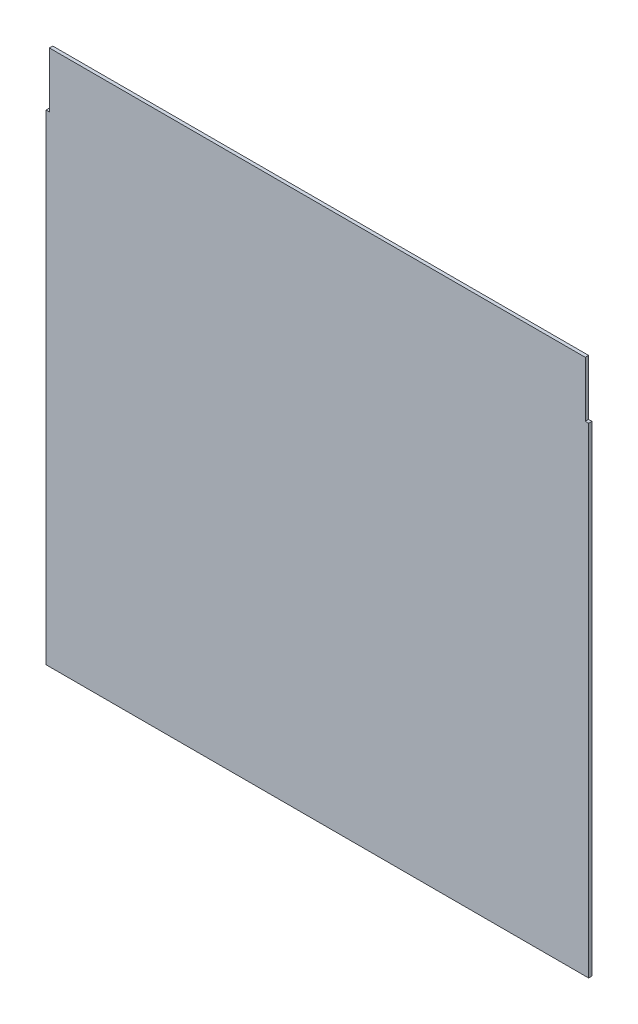
ISO-10303-21;
HEADER;
FILE_DESCRIPTION(('STEP AP214'),'2;1');
FILE_NAME('part.step','',(''),(''),'','','');
FILE_SCHEMA(('AUTOMOTIVE_DESIGN { 1 0 10303 214 1 1 1 1 }'));
ENDSEC;
DATA;
#1=APPLICATION_CONTEXT('core data for automotive mechanical design processes');
#2=APPLICATION_PROTOCOL_DEFINITION('international standard','automotive_design',2000,#1);
#3=PRODUCT_CONTEXT('',#1,'mechanical');
#4=PRODUCT('Part','Part','',(#3));
#5=PRODUCT_RELATED_PRODUCT_CATEGORY('part','',(#4));
#6=PRODUCT_DEFINITION_FORMATION('','',#4);
#7=PRODUCT_DEFINITION_CONTEXT('part definition',#1,'design');
#8=PRODUCT_DEFINITION('design','',#6,#7);
#9=PRODUCT_DEFINITION_SHAPE('','',#8);
#10=(LENGTH_UNIT() NAMED_UNIT(*) SI_UNIT(.MILLI.,.METRE.));
#11=(NAMED_UNIT(*) PLANE_ANGLE_UNIT() SI_UNIT($,.RADIAN.));
#12=(NAMED_UNIT(*) SI_UNIT($,.STERADIAN.) SOLID_ANGLE_UNIT());
#13=UNCERTAINTY_MEASURE_WITH_UNIT(LENGTH_MEASURE(1.E-05),#10,'distance_accuracy_value','');
#14=(GEOMETRIC_REPRESENTATION_CONTEXT(3) GLOBAL_UNCERTAINTY_ASSIGNED_CONTEXT((#13)) GLOBAL_UNIT_ASSIGNED_CONTEXT((#10,
#11,#12)) REPRESENTATION_CONTEXT('',''));
#15=CARTESIAN_POINT('',(0.,0.,0.));
#16=DIRECTION('',(0.,0.,1.));
#17=DIRECTION('',(1.,0.,0.));
#18=AXIS2_PLACEMENT_3D('',#15,#16,#17);
#19=CARTESIAN_POINT('',(254.,-254.,3.175));
#20=DIRECTION('',(-1.,0.,0.));
#21=DIRECTION('',(0.,0.,1.));
#22=AXIS2_PLACEMENT_3D('',#19,#20,#21);
#23=PLANE('',#22);
#24=DIRECTION('',(0.,0.,1.));
#25=VECTOR('',#24,1.);
#26=CARTESIAN_POINT('',(254.,201.45375,0.));
#27=LINE('',#26,#25);
#28=CARTESIAN_POINT('',(254.,201.45375,0.));
#29=VERTEX_POINT('',#28);
#30=CARTESIAN_POINT('',(254.,201.45375,3.175));
#31=VERTEX_POINT('',#30);
#32=EDGE_CURVE('E66',#29,#31,#27,.T.);
#33=ORIENTED_EDGE('',*,*,#32,.F.);
#34=DIRECTION('',(0.,1.,0.));
#35=VECTOR('',#34,1.);
#36=CARTESIAN_POINT('',(254.,-254.,0.));
#37=LINE('',#36,#35);
#38=CARTESIAN_POINT('',(254.,254.,0.));
#39=VERTEX_POINT('',#38);
#40=EDGE_CURVE('E163',#29,#39,#37,.T.);
#41=ORIENTED_EDGE('',*,*,#40,.T.);
#42=DIRECTION('',(0.,0.,-1.));
#43=VECTOR('',#42,1.);
#44=CARTESIAN_POINT('',(254.,254.,3.175));
#45=LINE('',#44,#43);
#46=CARTESIAN_POINT('',(254.,254.,3.175));
#47=VERTEX_POINT('',#46);
#48=EDGE_CURVE('E11',#47,#39,#45,.T.);
#49=ORIENTED_EDGE('',*,*,#48,.F.);
#50=DIRECTION('',(0.,1.,0.));
#51=VECTOR('',#50,1.);
#52=CARTESIAN_POINT('',(254.,-254.,3.175));
#53=LINE('',#52,#51);
#54=EDGE_CURVE('E169',#31,#47,#53,.T.);
#55=ORIENTED_EDGE('',*,*,#54,.F.);
#56=EDGE_LOOP('',(#33,#41,#49,#55));
#57=FACE_BOUND('',#56,.T.);
#58=ADVANCED_FACE('F43',(#57),#23,.F.);
#59=CARTESIAN_POINT('',(-254.,254.,3.175));
#60=DIRECTION('',(0.,-1.,0.));
#61=DIRECTION('',(0.,0.,-1.));
#62=AXIS2_PLACEMENT_3D('',#59,#60,#61);
#63=PLANE('',#62);
#64=DIRECTION('',(-1.,0.,0.));
#65=VECTOR('',#64,1.);
#66=CARTESIAN_POINT('',(-254.,254.,0.));
#67=LINE('',#66,#65);
#68=CARTESIAN_POINT('',(-254.,254.,0.));
#69=VERTEX_POINT('',#68);
#70=EDGE_CURVE('E180',#39,#69,#67,.T.);
#71=ORIENTED_EDGE('',*,*,#70,.T.);
#72=DIRECTION('',(0.,0.,-1.));
#73=VECTOR('',#72,1.);
#74=CARTESIAN_POINT('',(-254.,254.,3.175));
#75=LINE('',#74,#73);
#76=CARTESIAN_POINT('',(-254.,254.,3.175));
#77=VERTEX_POINT('',#76);
#78=EDGE_CURVE('E51',#77,#69,#75,.T.);
#79=ORIENTED_EDGE('',*,*,#78,.F.);
#80=DIRECTION('',(-1.,0.,0.));
#81=VECTOR('',#80,1.);
#82=CARTESIAN_POINT('',(-254.,254.,3.175));
#83=LINE('',#82,#81);
#84=EDGE_CURVE('E172',#47,#77,#83,.T.);
#85=ORIENTED_EDGE('',*,*,#84,.F.);
#86=ORIENTED_EDGE('',*,*,#48,.T.);
#87=EDGE_LOOP('',(#71,#79,#85,#86));
#88=FACE_BOUND('',#87,.T.);
#89=ADVANCED_FACE('F206',(#88),#63,.F.);
#90=CARTESIAN_POINT('',(-254.,-254.,3.175));
#91=DIRECTION('',(1.,0.,0.));
#92=DIRECTION('',(0.,0.,-1.));
#93=AXIS2_PLACEMENT_3D('',#90,#91,#92);
#94=PLANE('',#93);
#95=DIRECTION('',(0.,-1.,0.));
#96=VECTOR('',#95,1.);
#97=CARTESIAN_POINT('',(-254.,-254.,0.));
#98=LINE('',#97,#96);
#99=CARTESIAN_POINT('',(-254.,201.45375,0.));
#100=VERTEX_POINT('',#99);
#101=EDGE_CURVE('E183',#69,#100,#98,.T.);
#102=ORIENTED_EDGE('',*,*,#101,.T.);
#103=DIRECTION('',(0.,0.,1.));
#104=VECTOR('',#103,1.);
#105=CARTESIAN_POINT('',(-254.,201.45375,0.));
#106=LINE('',#105,#104);
#107=CARTESIAN_POINT('',(-254.,201.45375,3.175));
#108=VERTEX_POINT('',#107);
#109=EDGE_CURVE('E145',#100,#108,#106,.T.);
#110=ORIENTED_EDGE('',*,*,#109,.T.);
#111=DIRECTION('',(0.,-1.,0.));
#112=VECTOR('',#111,1.);
#113=CARTESIAN_POINT('',(-254.,-254.,3.175));
#114=LINE('',#113,#112);
#115=EDGE_CURVE('E120',#77,#108,#114,.T.);
#116=ORIENTED_EDGE('',*,*,#115,.F.);
#117=ORIENTED_EDGE('',*,*,#78,.T.);
#118=EDGE_LOOP('',(#102,#110,#116,#117));
#119=FACE_BOUND('',#118,.T.);
#120=ADVANCED_FACE('F194',(#119),#94,.F.);
#121=CARTESIAN_POINT('',(-254.,-254.,3.175));
#122=DIRECTION('',(0.,1.,0.));
#123=DIRECTION('',(0.,0.,1.));
#124=AXIS2_PLACEMENT_3D('',#121,#122,#123);
#125=PLANE('',#124);
#126=DIRECTION('',(1.,0.,0.));
#127=VECTOR('',#126,1.);
#128=CARTESIAN_POINT('',(-254.,-254.,0.));
#129=LINE('',#128,#127);
#130=CARTESIAN_POINT('',(-257.175,-254.,0.));
#131=VERTEX_POINT('',#130);
#132=CARTESIAN_POINT('',(257.175,-254.,0.));
#133=VERTEX_POINT('',#132);
#134=EDGE_CURVE('E173',#131,#133,#129,.T.);
#135=ORIENTED_EDGE('',*,*,#134,.T.);
#136=DIRECTION('',(0.,0.,1.));
#137=VECTOR('',#136,1.);
#138=CARTESIAN_POINT('',(257.175,-254.,0.));
#139=LINE('',#138,#137);
#140=CARTESIAN_POINT('',(257.175,-254.,3.175));
#141=VERTEX_POINT('',#140);
#142=EDGE_CURVE('E114',#133,#141,#139,.T.);
#143=ORIENTED_EDGE('',*,*,#142,.T.);
#144=DIRECTION('',(1.,0.,0.));
#145=VECTOR('',#144,1.);
#146=CARTESIAN_POINT('',(-254.,-254.,3.175));
#147=LINE('',#146,#145);
#148=CARTESIAN_POINT('',(-257.175,-254.,3.175));
#149=VERTEX_POINT('',#148);
#150=EDGE_CURVE('E108',#149,#141,#147,.T.);
#151=ORIENTED_EDGE('',*,*,#150,.F.);
#152=DIRECTION('',(0.,0.,1.));
#153=VECTOR('',#152,1.);
#154=CARTESIAN_POINT('',(-257.175,-254.,0.));
#155=LINE('',#154,#153);
#156=EDGE_CURVE('E111',#131,#149,#155,.T.);
#157=ORIENTED_EDGE('',*,*,#156,.F.);
#158=EDGE_LOOP('',(#135,#143,#151,#157));
#159=FACE_BOUND('',#158,.T.);
#160=ADVANCED_FACE('F110',(#159),#125,.F.);
#161=CARTESIAN_POINT('',(0.,0.,3.175));
#162=DIRECTION('',(0.,0.,-1.));
#163=DIRECTION('',(-1.,0.,0.));
#164=AXIS2_PLACEMENT_3D('',#161,#162,#163);
#165=PLANE('',#164);
#166=ORIENTED_EDGE('',*,*,#150,.T.);
#167=DIRECTION('',(0.,1.,0.));
#168=VECTOR('',#167,1.);
#169=CARTESIAN_POINT('',(257.175,201.45375,3.175));
#170=LINE('',#169,#168);
#171=CARTESIAN_POINT('',(257.175,201.45375,3.175));
#172=VERTEX_POINT('',#171);
#173=EDGE_CURVE('E138',#141,#172,#170,.T.);
#174=ORIENTED_EDGE('',*,*,#173,.T.);
#175=DIRECTION('',(-1.,0.,0.));
#176=VECTOR('',#175,1.);
#177=CARTESIAN_POINT('',(254.,201.45375,3.175));
#178=LINE('',#177,#176);
#179=EDGE_CURVE('E152',#172,#31,#178,.T.);
#180=ORIENTED_EDGE('',*,*,#179,.T.);
#181=ORIENTED_EDGE('',*,*,#54,.T.);
#182=ORIENTED_EDGE('',*,*,#84,.T.);
#183=ORIENTED_EDGE('',*,*,#115,.T.);
#184=DIRECTION('',(-1.,0.,0.));
#185=VECTOR('',#184,1.);
#186=CARTESIAN_POINT('',(-254.,201.45375,3.175));
#187=LINE('',#186,#185);
#188=CARTESIAN_POINT('',(-257.175,201.45375,3.175));
#189=VERTEX_POINT('',#188);
#190=EDGE_CURVE('E58',#108,#189,#187,.T.);
#191=ORIENTED_EDGE('',*,*,#190,.T.);
#192=DIRECTION('',(0.,-1.,0.));
#193=VECTOR('',#192,1.);
#194=CARTESIAN_POINT('',(-257.175,201.45375,3.175));
#195=LINE('',#194,#193);
#196=EDGE_CURVE('E125',#189,#149,#195,.T.);
#197=ORIENTED_EDGE('',*,*,#196,.T.);
#198=EDGE_LOOP('',(#166,#174,#180,#181,#182,#183,#191,#197));
#199=FACE_BOUND('',#198,.T.);
#200=ADVANCED_FACE('F131',(#199),#165,.F.);
#201=CARTESIAN_POINT('',(0.,0.,0.));
#202=DIRECTION('',(0.,0.,-1.));
#203=DIRECTION('',(-1.,0.,0.));
#204=AXIS2_PLACEMENT_3D('',#201,#202,#203);
#205=PLANE('',#204);
#206=ORIENTED_EDGE('',*,*,#40,.F.);
#207=DIRECTION('',(-1.,0.,0.));
#208=VECTOR('',#207,1.);
#209=CARTESIAN_POINT('',(254.,201.45375,0.));
#210=LINE('',#209,#208);
#211=CARTESIAN_POINT('',(257.175,201.45375,0.));
#212=VERTEX_POINT('',#211);
#213=EDGE_CURVE('E151',#212,#29,#210,.T.);
#214=ORIENTED_EDGE('',*,*,#213,.F.);
#215=DIRECTION('',(0.,1.,0.));
#216=VECTOR('',#215,1.);
#217=CARTESIAN_POINT('',(257.175,201.45375,0.));
#218=LINE('',#217,#216);
#219=EDGE_CURVE('E147',#133,#212,#218,.T.);
#220=ORIENTED_EDGE('',*,*,#219,.F.);
#221=ORIENTED_EDGE('',*,*,#134,.F.);
#222=DIRECTION('',(0.,-1.,0.));
#223=VECTOR('',#222,1.);
#224=CARTESIAN_POINT('',(-257.175,201.45375,0.));
#225=LINE('',#224,#223);
#226=CARTESIAN_POINT('',(-257.175,201.45375,0.));
#227=VERTEX_POINT('',#226);
#228=EDGE_CURVE('E127',#227,#131,#225,.T.);
#229=ORIENTED_EDGE('',*,*,#228,.F.);
#230=DIRECTION('',(-1.,0.,0.));
#231=VECTOR('',#230,1.);
#232=CARTESIAN_POINT('',(-254.,201.45375,0.));
#233=LINE('',#232,#231);
#234=EDGE_CURVE('E134',#100,#227,#233,.T.);
#235=ORIENTED_EDGE('',*,*,#234,.F.);
#236=ORIENTED_EDGE('',*,*,#101,.F.);
#237=ORIENTED_EDGE('',*,*,#70,.F.);
#238=EDGE_LOOP('',(#206,#214,#220,#221,#229,#235,#236,#237));
#239=FACE_BOUND('',#238,.T.);
#240=ADVANCED_FACE('F200',(#239),#205,.T.);
#241=CARTESIAN_POINT('',(254.,201.45375,0.));
#242=DIRECTION('',(0.,1.,0.));
#243=DIRECTION('',(0.,0.,1.));
#244=AXIS2_PLACEMENT_3D('',#241,#242,#243);
#245=PLANE('',#244);
#246=ORIENTED_EDGE('',*,*,#179,.F.);
#247=DIRECTION('',(0.,0.,1.));
#248=VECTOR('',#247,1.);
#249=CARTESIAN_POINT('',(257.175,201.45375,0.));
#250=LINE('',#249,#248);
#251=EDGE_CURVE('E164',#212,#172,#250,.T.);
#252=ORIENTED_EDGE('',*,*,#251,.F.);
#253=ORIENTED_EDGE('',*,*,#213,.T.);
#254=ORIENTED_EDGE('',*,*,#32,.T.);
#255=EDGE_LOOP('',(#246,#252,#253,#254));
#256=FACE_BOUND('',#255,.T.);
#257=ADVANCED_FACE('F211',(#256),#245,.T.);
#258=CARTESIAN_POINT('',(257.175,201.45375,0.));
#259=DIRECTION('',(1.,0.,0.));
#260=DIRECTION('',(0.,1.,0.));
#261=AXIS2_PLACEMENT_3D('',#258,#259,#260);
#262=PLANE('',#261);
#263=ORIENTED_EDGE('',*,*,#173,.F.);
#264=ORIENTED_EDGE('',*,*,#142,.F.);
#265=ORIENTED_EDGE('',*,*,#219,.T.);
#266=ORIENTED_EDGE('',*,*,#251,.T.);
#267=EDGE_LOOP('',(#263,#264,#265,#266));
#268=FACE_BOUND('',#267,.T.);
#269=ADVANCED_FACE('F213',(#268),#262,.T.);
#270=CARTESIAN_POINT('',(-257.175,201.45375,0.));
#271=DIRECTION('',(-1.,0.,0.));
#272=DIRECTION('',(0.,-1.,0.));
#273=AXIS2_PLACEMENT_3D('',#270,#271,#272);
#274=PLANE('',#273);
#275=ORIENTED_EDGE('',*,*,#196,.F.);
#276=DIRECTION('',(0.,0.,1.));
#277=VECTOR('',#276,1.);
#278=CARTESIAN_POINT('',(-257.175,201.45375,0.));
#279=LINE('',#278,#277);
#280=EDGE_CURVE('E129',#227,#189,#279,.T.);
#281=ORIENTED_EDGE('',*,*,#280,.F.);
#282=ORIENTED_EDGE('',*,*,#228,.T.);
#283=ORIENTED_EDGE('',*,*,#156,.T.);
#284=EDGE_LOOP('',(#275,#281,#282,#283));
#285=FACE_BOUND('',#284,.T.);
#286=ADVANCED_FACE('F124',(#285),#274,.T.);
#287=CARTESIAN_POINT('',(-254.,201.45375,0.));
#288=DIRECTION('',(0.,1.,0.));
#289=DIRECTION('',(0.,0.,1.));
#290=AXIS2_PLACEMENT_3D('',#287,#288,#289);
#291=PLANE('',#290);
#292=ORIENTED_EDGE('',*,*,#190,.F.);
#293=ORIENTED_EDGE('',*,*,#109,.F.);
#294=ORIENTED_EDGE('',*,*,#234,.T.);
#295=ORIENTED_EDGE('',*,*,#280,.T.);
#296=EDGE_LOOP('',(#292,#293,#294,#295));
#297=FACE_BOUND('',#296,.T.);
#298=ADVANCED_FACE('F201',(#297),#291,.T.);
#299=CLOSED_SHELL('',(#58,#89,#120,#160,#200,#240,#257,#269,#286,#298));
#300=MANIFOLD_SOLID_BREP('B2',#299);
#301=ADVANCED_BREP_SHAPE_REPRESENTATION('',(#18,#300),#14);
#302=SHAPE_DEFINITION_REPRESENTATION(#9,#301);
ENDSEC;
END-ISO-10303-21;
